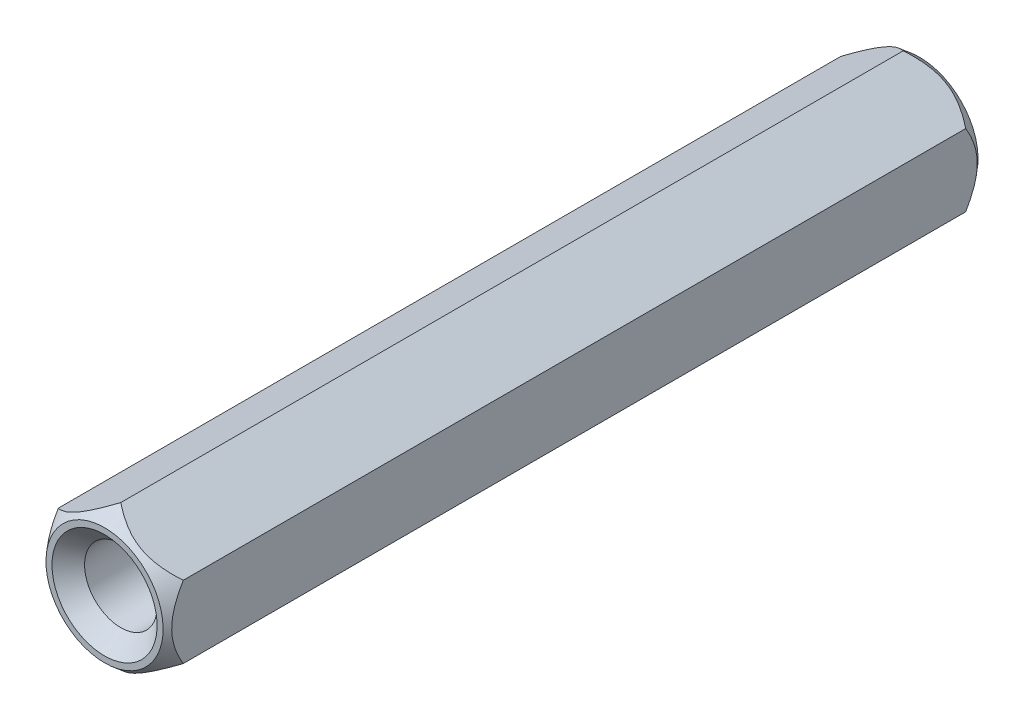
ISO-10303-21;
HEADER;
FILE_DESCRIPTION(('STEP AP214'),'2;1');
FILE_NAME('part.step','',(''),(''),'','','');
FILE_SCHEMA(('AUTOMOTIVE_DESIGN { 1 0 10303 214 1 1 1 1 }'));
ENDSEC;
DATA;
#1=APPLICATION_CONTEXT('core data for automotive mechanical design processes');
#2=APPLICATION_PROTOCOL_DEFINITION('international standard','automotive_design',2000,#1);
#3=PRODUCT_CONTEXT('',#1,'mechanical');
#4=PRODUCT('Part','Part','',(#3));
#5=PRODUCT_RELATED_PRODUCT_CATEGORY('part','',(#4));
#6=PRODUCT_DEFINITION_FORMATION('','',#4);
#7=PRODUCT_DEFINITION_CONTEXT('part definition',#1,'design');
#8=PRODUCT_DEFINITION('design','',#6,#7);
#9=PRODUCT_DEFINITION_SHAPE('','',#8);
#10=(LENGTH_UNIT() NAMED_UNIT(*) SI_UNIT(.MILLI.,.METRE.));
#11=(NAMED_UNIT(*) PLANE_ANGLE_UNIT() SI_UNIT($,.RADIAN.));
#12=(NAMED_UNIT(*) SI_UNIT($,.STERADIAN.) SOLID_ANGLE_UNIT());
#13=UNCERTAINTY_MEASURE_WITH_UNIT(LENGTH_MEASURE(1.E-05),#10,'distance_accuracy_value','');
#14=(GEOMETRIC_REPRESENTATION_CONTEXT(3) GLOBAL_UNCERTAINTY_ASSIGNED_CONTEXT((#13)) GLOBAL_UNIT_ASSIGNED_CONTEXT((#10,
#11,#12)) REPRESENTATION_CONTEXT('',''));
#15=CARTESIAN_POINT('',(0.,0.,0.));
#16=DIRECTION('',(0.,0.,1.));
#17=DIRECTION('',(1.,0.,0.));
#18=AXIS2_PLACEMENT_3D('',#15,#16,#17);
#19=CARTESIAN_POINT('',(-2.3,1.32790561913614,0.));
#20=DIRECTION('',(-1.,0.,0.));
#21=DIRECTION('',(0.,0.,1.));
#22=AXIS2_PLACEMENT_3D('',#19,#20,#21);
#23=PLANE('',#22);
#24=CARTESIAN_POINT('',(-2.3,1.32790561913614,0.599773485926734));
#25=CARTESIAN_POINT('',(-2.3,0.,-0.19696988555495));
#26=CARTESIAN_POINT('',(-2.3,-1.32790561913614,0.599773485926734));
#27=(BOUNDED_CURVE() B_SPLINE_CURVE(2,(#24,#25,#26),.UNSPECIFIED.,.F.,
.F.) B_SPLINE_CURVE_WITH_KNOTS((3,3),(3.43395925262809E-05,0.279023779085286),
.UNSPECIFIED.) CURVE() GEOMETRIC_REPRESENTATION_ITEM() RATIONAL_B_SPLINE_CURVE((1.0000380889664,
1.15474451972926,1.0000380889664)) REPRESENTATION_ITEM(''));
#28=CARTESIAN_POINT('',(-2.3,1.32790561913614,0.599773485926734));
#29=VERTEX_POINT('',#28);
#30=CARTESIAN_POINT('',(-2.3,-1.32790561913614,0.599773485926734));
#31=VERTEX_POINT('',#30);
#32=EDGE_CURVE('E135',#29,#31,#27,.T.);
#33=ORIENTED_EDGE('',*,*,#32,.T.);
#34=DIRECTION('',(0.,0.,1.));
#35=VECTOR('',#34,1.);
#36=CARTESIAN_POINT('',(-2.3,-1.32790561913614,0.));
#37=LINE('',#36,#35);
#38=CARTESIAN_POINT('',(-2.3,-1.32790561913614,29.4002265140733));
#39=VERTEX_POINT('',#38);
#40=EDGE_CURVE('E10',#31,#39,#37,.T.);
#41=ORIENTED_EDGE('',*,*,#40,.T.);
#42=CARTESIAN_POINT('',(-2.3,-1.32790561913614,29.4002265140733));
#43=CARTESIAN_POINT('',(-2.3,0.,30.196969885555));
#44=CARTESIAN_POINT('',(-2.3,1.32790561913614,29.4002265140733));
#45=(BOUNDED_CURVE() B_SPLINE_CURVE(2,(#42,#43,#44),.UNSPECIFIED.,.F.,
.F.) B_SPLINE_CURVE_WITH_KNOTS((3,3),(3.43395925265938E-05,0.279023779085286),
.UNSPECIFIED.) CURVE() GEOMETRIC_REPRESENTATION_ITEM() RATIONAL_B_SPLINE_CURVE((1.0000380889664,
1.15474451972925,1.0000380889664)) REPRESENTATION_ITEM(''));
#46=CARTESIAN_POINT('',(-2.3,1.32790561913614,29.4002265140733));
#47=VERTEX_POINT('',#46);
#48=EDGE_CURVE('E170',#39,#47,#45,.T.);
#49=ORIENTED_EDGE('',*,*,#48,.T.);
#50=DIRECTION('',(0.,0.,1.));
#51=VECTOR('',#50,1.);
#52=CARTESIAN_POINT('',(-2.3,1.32790561913614,0.));
#53=LINE('',#52,#51);
#54=EDGE_CURVE('E26',#29,#47,#53,.T.);
#55=ORIENTED_EDGE('',*,*,#54,.F.);
#56=EDGE_LOOP('',(#33,#41,#49,#55));
#57=FACE_BOUND('',#56,.T.);
#58=ADVANCED_FACE('F15',(#57),#23,.T.);
#59=CARTESIAN_POINT('',(-2.3,-1.32790561913614,0.));
#60=DIRECTION('',(-0.5,-0.866025403784439,0.));
#61=DIRECTION('',(-0.866025403784439,0.5,0.));
#62=AXIS2_PLACEMENT_3D('',#59,#60,#61);
#63=PLANE('',#62);
#64=CARTESIAN_POINT('',(-2.3,-1.32790561913614,0.599773485926734));
#65=CARTESIAN_POINT('',(-1.15,-1.99185842870421,-0.196969885554949));
#66=CARTESIAN_POINT('',(0.,-2.65581123827228,0.599773485926734));
#67=(BOUNDED_CURVE() B_SPLINE_CURVE(2,(#64,#65,#66),.UNSPECIFIED.,.F.,
.F.) B_SPLINE_CURVE_WITH_KNOTS((3,3),(3.43395925262649E-05,0.279023779085286),
.UNSPECIFIED.) CURVE() GEOMETRIC_REPRESENTATION_ITEM() RATIONAL_B_SPLINE_CURVE((1.0000380889664,
1.15474451972925,1.0000380889664)) REPRESENTATION_ITEM(''));
#68=CARTESIAN_POINT('',(0.,-2.65581123827228,0.599773485926734));
#69=VERTEX_POINT('',#68);
#70=EDGE_CURVE('E266',#31,#69,#67,.T.);
#71=ORIENTED_EDGE('',*,*,#70,.T.);
#72=DIRECTION('',(0.,0.,1.));
#73=VECTOR('',#72,1.);
#74=CARTESIAN_POINT('',(0.,-2.65581123827228,0.));
#75=LINE('',#74,#73);
#76=CARTESIAN_POINT('',(0.,-2.65581123827228,29.4002265140733));
#77=VERTEX_POINT('',#76);
#78=EDGE_CURVE('E140',#69,#77,#75,.T.);
#79=ORIENTED_EDGE('',*,*,#78,.T.);
#80=CARTESIAN_POINT('',(0.,-2.65581123827228,29.4002265140733));
#81=CARTESIAN_POINT('',(-1.15,-1.99185842870421,30.196969885555));
#82=CARTESIAN_POINT('',(-2.3,-1.32790561913614,29.4002265140733));
#83=(BOUNDED_CURVE() B_SPLINE_CURVE(2,(#80,#81,#82),.UNSPECIFIED.,.F.,
.F.) B_SPLINE_CURVE_WITH_KNOTS((3,3),(3.43395925253617E-05,0.279023779085284),
.UNSPECIFIED.) CURVE() GEOMETRIC_REPRESENTATION_ITEM() RATIONAL_B_SPLINE_CURVE((1.0000380889664,
1.15474451972924,1.0000380889664)) REPRESENTATION_ITEM(''));
#84=EDGE_CURVE('E186',#77,#39,#83,.T.);
#85=ORIENTED_EDGE('',*,*,#84,.T.);
#86=ORIENTED_EDGE('',*,*,#40,.F.);
#87=EDGE_LOOP('',(#71,#79,#85,#86));
#88=FACE_BOUND('',#87,.T.);
#89=ADVANCED_FACE('F300',(#88),#63,.T.);
#90=CARTESIAN_POINT('',(0.,2.65581123827228,0.));
#91=DIRECTION('',(-0.5,0.866025403784439,0.));
#92=DIRECTION('',(0.,0.,1.));
#93=AXIS2_PLACEMENT_3D('',#90,#91,#92);
#94=PLANE('',#93);
#95=CARTESIAN_POINT('',(0.,2.65581123827228,0.599773485926734));
#96=CARTESIAN_POINT('',(-1.15,1.99185842870421,-0.196969885554951));
#97=CARTESIAN_POINT('',(-2.3,1.32790561913614,0.599773485926734));
#98=(BOUNDED_CURVE() B_SPLINE_CURVE(2,(#95,#96,#97),.UNSPECIFIED.,.F.,
.F.) B_SPLINE_CURVE_WITH_KNOTS((3,3),(3.43395925263038E-05,0.279023779085286),
.UNSPECIFIED.) CURVE() GEOMETRIC_REPRESENTATION_ITEM() RATIONAL_B_SPLINE_CURVE((1.0000380889664,
1.15474451972925,1.0000380889664)) REPRESENTATION_ITEM(''));
#99=CARTESIAN_POINT('',(0.,2.65581123827228,0.599773485926734));
#100=VERTEX_POINT('',#99);
#101=EDGE_CURVE('E154',#100,#29,#98,.T.);
#102=ORIENTED_EDGE('',*,*,#101,.T.);
#103=ORIENTED_EDGE('',*,*,#54,.T.);
#104=CARTESIAN_POINT('',(-2.3,1.32790561913614,29.4002265140733));
#105=CARTESIAN_POINT('',(-1.15,1.99185842870421,30.1969698855549));
#106=CARTESIAN_POINT('',(0.,2.65581123827228,29.4002265140733));
#107=(BOUNDED_CURVE() B_SPLINE_CURVE(2,(#104,#105,#106),.UNSPECIFIED.,.F.,
.F.) B_SPLINE_CURVE_WITH_KNOTS((3,3),(3.43395925253182E-05,0.279023779085284),
.UNSPECIFIED.) CURVE() GEOMETRIC_REPRESENTATION_ITEM() RATIONAL_B_SPLINE_CURVE((1.0000380889664,
1.15474451972924,1.0000380889664)) REPRESENTATION_ITEM(''));
#108=CARTESIAN_POINT('',(0.,2.65581123827228,29.4002265140733));
#109=VERTEX_POINT('',#108);
#110=EDGE_CURVE('E162',#47,#109,#107,.T.);
#111=ORIENTED_EDGE('',*,*,#110,.T.);
#112=DIRECTION('',(0.,0.,1.));
#113=VECTOR('',#112,1.);
#114=CARTESIAN_POINT('',(0.,2.65581123827228,0.));
#115=LINE('',#114,#113);
#116=EDGE_CURVE('E172',#100,#109,#115,.T.);
#117=ORIENTED_EDGE('',*,*,#116,.F.);
#118=EDGE_LOOP('',(#102,#103,#111,#117));
#119=FACE_BOUND('',#118,.T.);
#120=ADVANCED_FACE('F409',(#119),#94,.T.);
#121=CARTESIAN_POINT('',(0.,0.,29.7));
#122=DIRECTION('',(0.,0.,-1.));
#123=DIRECTION('',(0.,1.,0.));
#124=AXIS2_PLACEMENT_3D('',#121,#122,#123);
#125=CONICAL_SURFACE('',#124,2.406,0.694738276196703);
#126=CARTESIAN_POINT('',(2.3,-1.32790561913614,29.4002265140733));
#127=CARTESIAN_POINT('',(1.15,-1.99185842870421,30.196969885555));
#128=CARTESIAN_POINT('',(0.,-2.65581123827228,29.4002265140733));
#129=(BOUNDED_CURVE() B_SPLINE_CURVE(2,(#126,#127,#128),.UNSPECIFIED.,.F.,
.F.) B_SPLINE_CURVE_WITH_KNOTS((3,3),(3.43395925266547E-05,0.279023779085286),
.UNSPECIFIED.) CURVE() GEOMETRIC_REPRESENTATION_ITEM() RATIONAL_B_SPLINE_CURVE((1.0000380889664,
1.15474451972925,1.0000380889664)) REPRESENTATION_ITEM(''));
#130=CARTESIAN_POINT('',(2.3,-1.32790561913614,29.4002265140733));
#131=VERTEX_POINT('',#130);
#132=EDGE_CURVE('E134',#131,#77,#129,.T.);
#133=ORIENTED_EDGE('',*,*,#132,.F.);
#134=CARTESIAN_POINT('',(2.3,1.32790561913614,29.4002265140733));
#135=CARTESIAN_POINT('',(2.3,0.,30.196969885555));
#136=CARTESIAN_POINT('',(2.3,-1.32790561913614,29.4002265140733));
#137=(BOUNDED_CURVE() B_SPLINE_CURVE(2,(#134,#135,#136),.UNSPECIFIED.,.F.,
.F.) B_SPLINE_CURVE_WITH_KNOTS((3,3),(3.43395925266313E-05,0.279023779085287),
.UNSPECIFIED.) CURVE() GEOMETRIC_REPRESENTATION_ITEM() RATIONAL_B_SPLINE_CURVE((1.0000380889664,
1.15474451972924,1.0000380889664)) REPRESENTATION_ITEM(''));
#138=CARTESIAN_POINT('',(2.3,1.32790561913614,29.4002265140733));
#139=VERTEX_POINT('',#138);
#140=EDGE_CURVE('E129',#139,#131,#137,.T.);
#141=ORIENTED_EDGE('',*,*,#140,.F.);
#142=CARTESIAN_POINT('',(0.,2.65581123827228,29.4002265140733));
#143=CARTESIAN_POINT('',(1.15,1.99185842870421,30.1969698855549));
#144=CARTESIAN_POINT('',(2.3,1.32790561913614,29.4002265140733));
#145=(BOUNDED_CURVE() B_SPLINE_CURVE(2,(#142,#143,#144),.UNSPECIFIED.,.F.,
.F.) B_SPLINE_CURVE_WITH_KNOTS((3,3),(3.43395925258995E-05,0.279023779085286),
.UNSPECIFIED.) CURVE() GEOMETRIC_REPRESENTATION_ITEM() RATIONAL_B_SPLINE_CURVE((1.0000380889664,
1.15474451972925,1.0000380889664)) REPRESENTATION_ITEM(''));
#146=EDGE_CURVE('E171',#109,#139,#145,.T.);
#147=ORIENTED_EDGE('',*,*,#146,.F.);
#148=ORIENTED_EDGE('',*,*,#110,.F.);
#149=ORIENTED_EDGE('',*,*,#48,.F.);
#150=ORIENTED_EDGE('',*,*,#84,.F.);
#151=DIRECTION('',(0.,0.64018439966448,0.768221279597376));
#152=VECTOR('',#151,1.);
#153=CARTESIAN_POINT('',(0.,-2.406,29.7));
#154=LINE('',#153,#152);
#155=CARTESIAN_POINT('',(0.,-2.156,30.));
#156=VERTEX_POINT('',#155);
#157=EDGE_CURVE('E96',#77,#156,#154,.T.);
#158=ORIENTED_EDGE('',*,*,#157,.T.);
#159=CARTESIAN_POINT('',(0.,0.,30.));
#160=DIRECTION('',(0.,0.,1.));
#161=DIRECTION('',(0.,1.,0.));
#162=AXIS2_PLACEMENT_3D('',#159,#160,#161);
#163=CIRCLE('',#162,2.156);
#164=EDGE_CURVE('E182',#156,#156,#163,.T.);
#165=ORIENTED_EDGE('',*,*,#164,.F.);
#166=ORIENTED_EDGE('',*,*,#157,.F.);
#167=EDGE_LOOP('',(#133,#141,#147,#148,#149,#150,#158,#165,#166));
#168=FACE_BOUND('',#167,.T.);
#169=ADVANCED_FACE('F296',(#168),#125,.T.);
#170=CARTESIAN_POINT('',(2.3,1.32790561913614,0.));
#171=DIRECTION('',(0.5,0.866025403784439,0.));
#172=DIRECTION('',(0.,0.,-1.));
#173=AXIS2_PLACEMENT_3D('',#170,#171,#172);
#174=PLANE('',#173);
#175=CARTESIAN_POINT('',(2.3,1.32790561913614,0.599773485926734));
#176=CARTESIAN_POINT('',(1.15,1.99185842870421,-0.19696988555495));
#177=CARTESIAN_POINT('',(0.,2.65581123827228,0.599773485926734));
#178=(BOUNDED_CURVE() B_SPLINE_CURVE(2,(#175,#176,#177),.UNSPECIFIED.,.F.,
.F.) B_SPLINE_CURVE_WITH_KNOTS((3,3),(3.4339592526264E-05,0.279023779085286),
.UNSPECIFIED.) CURVE() GEOMETRIC_REPRESENTATION_ITEM() RATIONAL_B_SPLINE_CURVE((1.0000380889664,
1.15474451972925,1.0000380889664)) REPRESENTATION_ITEM(''));
#179=CARTESIAN_POINT('',(2.3,1.32790561913614,0.599773485926734));
#180=VERTEX_POINT('',#179);
#181=EDGE_CURVE('E147',#180,#100,#178,.T.);
#182=ORIENTED_EDGE('',*,*,#181,.T.);
#183=ORIENTED_EDGE('',*,*,#116,.T.);
#184=ORIENTED_EDGE('',*,*,#146,.T.);
#185=DIRECTION('',(0.,0.,1.));
#186=VECTOR('',#185,1.);
#187=CARTESIAN_POINT('',(2.3,1.32790561913614,0.));
#188=LINE('',#187,#186);
#189=EDGE_CURVE('E113',#180,#139,#188,.T.);
#190=ORIENTED_EDGE('',*,*,#189,.F.);
#191=EDGE_LOOP('',(#182,#183,#184,#190));
#192=FACE_BOUND('',#191,.T.);
#193=ADVANCED_FACE('F449',(#192),#174,.T.);
#194=CARTESIAN_POINT('',(2.3,-1.32790561913614,0.));
#195=DIRECTION('',(1.,0.,0.));
#196=DIRECTION('',(0.,-1.,0.));
#197=AXIS2_PLACEMENT_3D('',#194,#195,#196);
#198=PLANE('',#197);
#199=CARTESIAN_POINT('',(2.3,-1.32790561913614,0.599773485926734));
#200=CARTESIAN_POINT('',(2.3,0.,-0.196969885554951));
#201=CARTESIAN_POINT('',(2.3,1.32790561913614,0.599773485926734));
#202=(BOUNDED_CURVE() B_SPLINE_CURVE(2,(#199,#200,#201),.UNSPECIFIED.,.F.,
.F.) B_SPLINE_CURVE_WITH_KNOTS((3,3),(3.43395925263431E-05,0.279023779085286),
.UNSPECIFIED.) CURVE() GEOMETRIC_REPRESENTATION_ITEM() RATIONAL_B_SPLINE_CURVE((1.0000380889664,
1.15474451972926,1.0000380889664)) REPRESENTATION_ITEM(''));
#203=CARTESIAN_POINT('',(2.3,-1.32790561913614,0.599773485926734));
#204=VERTEX_POINT('',#203);
#205=EDGE_CURVE('E126',#204,#180,#202,.T.);
#206=ORIENTED_EDGE('',*,*,#205,.T.);
#207=ORIENTED_EDGE('',*,*,#189,.T.);
#208=ORIENTED_EDGE('',*,*,#140,.T.);
#209=DIRECTION('',(0.,0.,1.));
#210=VECTOR('',#209,1.);
#211=CARTESIAN_POINT('',(2.3,-1.32790561913614,0.));
#212=LINE('',#211,#210);
#213=EDGE_CURVE('E122',#204,#131,#212,.T.);
#214=ORIENTED_EDGE('',*,*,#213,.F.);
#215=EDGE_LOOP('',(#206,#207,#208,#214));
#216=FACE_BOUND('',#215,.T.);
#217=ADVANCED_FACE('F124',(#216),#198,.T.);
#218=CARTESIAN_POINT('',(0.,-2.65581123827228,0.));
#219=DIRECTION('',(0.5,-0.866025403784439,0.));
#220=DIRECTION('',(0.,0.,-1.));
#221=AXIS2_PLACEMENT_3D('',#218,#219,#220);
#222=PLANE('',#221);
#223=CARTESIAN_POINT('',(0.,-2.65581123827228,0.599773485926734));
#224=CARTESIAN_POINT('',(1.15,-1.99185842870421,-0.196969885554949));
#225=CARTESIAN_POINT('',(2.3,-1.32790561913614,0.599773485926734));
#226=(BOUNDED_CURVE() B_SPLINE_CURVE(2,(#223,#224,#225),.UNSPECIFIED.,.F.,
.F.) B_SPLINE_CURVE_WITH_KNOTS((3,3),(3.43395925263024E-05,0.279023779085286),
.UNSPECIFIED.) CURVE() GEOMETRIC_REPRESENTATION_ITEM() RATIONAL_B_SPLINE_CURVE((1.0000380889664,
1.15474451972925,1.0000380889664)) REPRESENTATION_ITEM(''));
#227=EDGE_CURVE('E137',#69,#204,#226,.T.);
#228=ORIENTED_EDGE('',*,*,#227,.T.);
#229=ORIENTED_EDGE('',*,*,#213,.T.);
#230=ORIENTED_EDGE('',*,*,#132,.T.);
#231=ORIENTED_EDGE('',*,*,#78,.F.);
#232=EDGE_LOOP('',(#228,#229,#230,#231));
#233=FACE_BOUND('',#232,.T.);
#234=ADVANCED_FACE('F138',(#233),#222,.T.);
#235=CARTESIAN_POINT('',(0.,0.,0.3));
#236=DIRECTION('',(0.,0.,1.));
#237=DIRECTION('',(0.,1.,0.));
#238=AXIS2_PLACEMENT_3D('',#235,#236,#237);
#239=CONICAL_SURFACE('',#238,2.406,0.694738276196703);
#240=ORIENTED_EDGE('',*,*,#101,.F.);
#241=ORIENTED_EDGE('',*,*,#181,.F.);
#242=ORIENTED_EDGE('',*,*,#205,.F.);
#243=ORIENTED_EDGE('',*,*,#227,.F.);
#244=DIRECTION('',(0.,0.64018439966448,-0.768221279597376));
#245=VECTOR('',#244,1.);
#246=CARTESIAN_POINT('',(0.,-2.406,0.3));
#247=LINE('',#246,#245);
#248=CARTESIAN_POINT('',(0.,-2.156,0.));
#249=VERTEX_POINT('',#248);
#250=EDGE_CURVE('E19',#69,#249,#247,.T.);
#251=ORIENTED_EDGE('',*,*,#250,.T.);
#252=CARTESIAN_POINT('',(0.,0.,0.));
#253=DIRECTION('',(0.,0.,-1.));
#254=DIRECTION('',(0.,1.,0.));
#255=AXIS2_PLACEMENT_3D('',#252,#253,#254);
#256=CIRCLE('',#255,2.156);
#257=EDGE_CURVE('E185',#249,#249,#256,.T.);
#258=ORIENTED_EDGE('',*,*,#257,.F.);
#259=ORIENTED_EDGE('',*,*,#250,.F.);
#260=ORIENTED_EDGE('',*,*,#70,.F.);
#261=ORIENTED_EDGE('',*,*,#32,.F.);
#262=EDGE_LOOP('',(#240,#241,#242,#243,#251,#258,#259,#260,#261));
#263=FACE_BOUND('',#262,.T.);
#264=ADVANCED_FACE('F146',(#263),#239,.T.);
#265=CARTESIAN_POINT('',(0.,0.,0.));
#266=DIRECTION('',(0.,0.,1.));
#267=DIRECTION('',(1.,0.,0.));
#268=AXIS2_PLACEMENT_3D('',#265,#266,#267);
#269=PLANE('',#268);
#270=CARTESIAN_POINT('',(0.,0.,0.));
#271=DIRECTION('',(0.,0.,-1.));
#272=DIRECTION('',(1.,0.,0.));
#273=AXIS2_PLACEMENT_3D('',#270,#271,#272);
#274=CIRCLE('',#273,1.93555);
#275=CARTESIAN_POINT('',(-1.93555,0.,0.));
#276=VERTEX_POINT('',#275);
#277=EDGE_CURVE('E86',#276,#276,#274,.T.);
#278=ORIENTED_EDGE('',*,*,#277,.F.);
#279=EDGE_LOOP('',(#278));
#280=FACE_BOUND('',#279,.T.);
#281=ORIENTED_EDGE('',*,*,#257,.T.);
#282=EDGE_LOOP('',(#281));
#283=FACE_BOUND('',#282,.T.);
#284=ADVANCED_FACE('F429',(#280,#283),#269,.F.);
#285=CARTESIAN_POINT('',(0.,0.,0.3));
#286=DIRECTION('',(0.,0.,-1.));
#287=DIRECTION('',(1.,0.,0.));
#288=AXIS2_PLACEMENT_3D('',#285,#286,#287);
#289=CONICAL_SURFACE('',#288,1.63555,0.785398163397448);
#290=CARTESIAN_POINT('',(0.,0.,0.6));
#291=DIRECTION('',(0.,0.,1.));
#292=DIRECTION('',(1.,0.,0.));
#293=AXIS2_PLACEMENT_3D('',#290,#291,#292);
#294=CIRCLE('',#293,1.33555);
#295=CARTESIAN_POINT('',(-1.33555,0.,0.6));
#296=VERTEX_POINT('',#295);
#297=EDGE_CURVE('E211',#296,#296,#294,.T.);
#298=ORIENTED_EDGE('',*,*,#297,.T.);
#299=DIRECTION('',(-0.707106781186548,0.,-0.707106781186548));
#300=VECTOR('',#299,1.);
#301=CARTESIAN_POINT('',(-1.63555,0.,0.3));
#302=LINE('',#301,#300);
#303=EDGE_CURVE('E179',#296,#276,#302,.T.);
#304=ORIENTED_EDGE('',*,*,#303,.T.);
#305=ORIENTED_EDGE('',*,*,#277,.T.);
#306=ORIENTED_EDGE('',*,*,#303,.F.);
#307=EDGE_LOOP('',(#298,#304,#305,#306));
#308=FACE_BOUND('',#307,.T.);
#309=ADVANCED_FACE('F295',(#308),#289,.F.);
#310=CARTESIAN_POINT('',(0.,0.,30.));
#311=DIRECTION('',(0.,0.,1.));
#312=DIRECTION('',(1.,0.,0.));
#313=AXIS2_PLACEMENT_3D('',#310,#311,#312);
#314=PLANE('',#313);
#315=CARTESIAN_POINT('',(0.,0.,30.));
#316=DIRECTION('',(0.,0.,1.));
#317=DIRECTION('',(1.,0.,0.));
#318=AXIS2_PLACEMENT_3D('',#315,#316,#317);
#319=CIRCLE('',#318,1.93555);
#320=CARTESIAN_POINT('',(-1.93555,0.,30.));
#321=VERTEX_POINT('',#320);
#322=EDGE_CURVE('E160',#321,#321,#319,.T.);
#323=ORIENTED_EDGE('',*,*,#322,.F.);
#324=EDGE_LOOP('',(#323));
#325=FACE_BOUND('',#324,.T.);
#326=ORIENTED_EDGE('',*,*,#164,.T.);
#327=EDGE_LOOP('',(#326));
#328=FACE_BOUND('',#327,.T.);
#329=ADVANCED_FACE('F17',(#325,#328),#314,.T.);
#330=CARTESIAN_POINT('',(0.,0.,0.));
#331=DIRECTION('',(0.,0.,1.));
#332=DIRECTION('',(1.,0.,0.));
#333=AXIS2_PLACEMENT_3D('',#330,#331,#332);
#334=CYLINDRICAL_SURFACE('',#333,1.33555);
#335=CARTESIAN_POINT('',(0.,0.,29.4));
#336=DIRECTION('',(0.,0.,-1.));
#337=DIRECTION('',(1.,0.,0.));
#338=AXIS2_PLACEMENT_3D('',#335,#336,#337);
#339=CIRCLE('',#338,1.33555);
#340=CARTESIAN_POINT('',(-1.33555,0.,29.4));
#341=VERTEX_POINT('',#340);
#342=EDGE_CURVE('E229',#341,#341,#339,.T.);
#343=ORIENTED_EDGE('',*,*,#342,.F.);
#344=DIRECTION('',(0.,0.,-1.));
#345=VECTOR('',#344,1.);
#346=CARTESIAN_POINT('',(-1.33555,0.,0.));
#347=LINE('',#346,#345);
#348=EDGE_CURVE('E218',#341,#296,#347,.T.);
#349=ORIENTED_EDGE('',*,*,#348,.T.);
#350=ORIENTED_EDGE('',*,*,#297,.F.);
#351=ORIENTED_EDGE('',*,*,#348,.F.);
#352=EDGE_LOOP('',(#343,#349,#350,#351));
#353=FACE_BOUND('',#352,.T.);
#354=ADVANCED_FACE('F294',(#353),#334,.F.);
#355=CARTESIAN_POINT('',(0.,0.,29.7));
#356=DIRECTION('',(0.,0.,1.));
#357=DIRECTION('',(1.,0.,0.));
#358=AXIS2_PLACEMENT_3D('',#355,#356,#357);
#359=CONICAL_SURFACE('',#358,1.63555,0.785398163397448);
#360=ORIENTED_EDGE('',*,*,#342,.T.);
#361=DIRECTION('',(-0.707106781186547,0.,0.707106781186548));
#362=VECTOR('',#361,1.);
#363=CARTESIAN_POINT('',(-1.63555,0.,29.7));
#364=LINE('',#363,#362);
#365=EDGE_CURVE('E233',#341,#321,#364,.T.);
#366=ORIENTED_EDGE('',*,*,#365,.T.);
#367=ORIENTED_EDGE('',*,*,#322,.T.);
#368=ORIENTED_EDGE('',*,*,#365,.F.);
#369=EDGE_LOOP('',(#360,#366,#367,#368));
#370=FACE_BOUND('',#369,.T.);
#371=ADVANCED_FACE('F290',(#370),#359,.F.);
#372=CLOSED_SHELL('',(#58,#89,#120,#169,#193,#217,#234,#264,#284,#309,#329,#354,#371));
#373=MANIFOLD_SOLID_BREP('B1',#372);
#374=ADVANCED_BREP_SHAPE_REPRESENTATION('',(#18,#373),#14);
#375=SHAPE_DEFINITION_REPRESENTATION(#9,#374);
ENDSEC;
END-ISO-10303-21;
